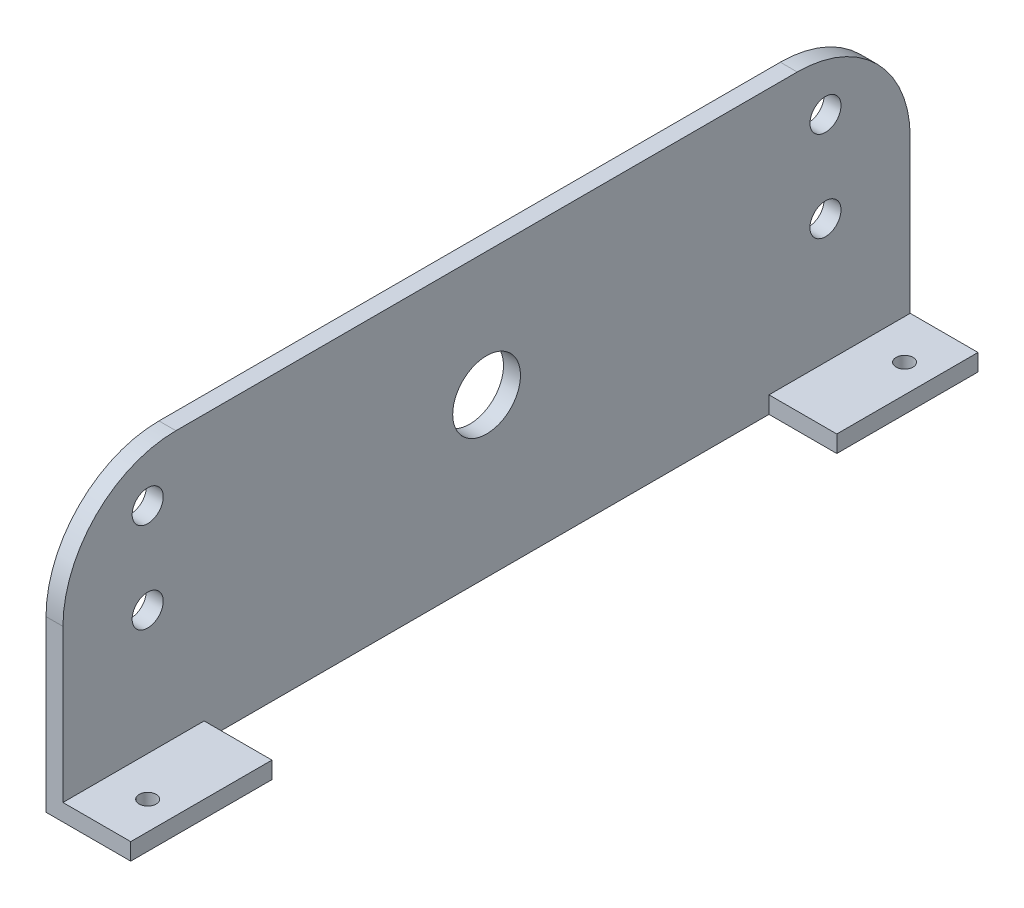
ISO-10303-21;
HEADER;
FILE_DESCRIPTION(('STEP AP214'),'2;1');
FILE_NAME('part.step','',(''),(''),'','','');
FILE_SCHEMA(('AUTOMOTIVE_DESIGN { 1 0 10303 214 1 1 1 1 }'));
ENDSEC;
DATA;
#1=APPLICATION_CONTEXT('core data for automotive mechanical design processes');
#2=APPLICATION_PROTOCOL_DEFINITION('international standard','automotive_design',2000,#1);
#3=PRODUCT_CONTEXT('',#1,'mechanical');
#4=PRODUCT('Part','Part','',(#3));
#5=PRODUCT_RELATED_PRODUCT_CATEGORY('part','',(#4));
#6=PRODUCT_DEFINITION_FORMATION('','',#4);
#7=PRODUCT_DEFINITION_CONTEXT('part definition',#1,'design');
#8=PRODUCT_DEFINITION('design','',#6,#7);
#9=PRODUCT_DEFINITION_SHAPE('','',#8);
#10=(LENGTH_UNIT() NAMED_UNIT(*) SI_UNIT(.MILLI.,.METRE.));
#11=(NAMED_UNIT(*) PLANE_ANGLE_UNIT() SI_UNIT($,.RADIAN.));
#12=(NAMED_UNIT(*) SI_UNIT($,.STERADIAN.) SOLID_ANGLE_UNIT());
#13=UNCERTAINTY_MEASURE_WITH_UNIT(LENGTH_MEASURE(1.E-05),#10,'distance_accuracy_value','');
#14=(GEOMETRIC_REPRESENTATION_CONTEXT(3) GLOBAL_UNCERTAINTY_ASSIGNED_CONTEXT((#13)) GLOBAL_UNIT_ASSIGNED_CONTEXT((#10,
#11,#12)) REPRESENTATION_CONTEXT('',''));
#15=CARTESIAN_POINT('',(0.,0.,0.));
#16=DIRECTION('',(0.,0.,1.));
#17=DIRECTION('',(1.,0.,0.));
#18=AXIS2_PLACEMENT_3D('',#15,#16,#17);
#19=CARTESIAN_POINT('',(3.,0.,0.));
#20=DIRECTION('',(-1.,0.,0.));
#21=DIRECTION('',(0.,0.,1.));
#22=AXIS2_PLACEMENT_3D('',#19,#20,#21);
#23=PLANE('',#22);
#24=CARTESIAN_POINT('',(3.,28.,0.));
#25=DIRECTION('',(-1.,0.,0.));
#26=DIRECTION('',(0.,0.,1.));
#27=AXIS2_PLACEMENT_3D('',#24,#25,#26);
#28=CIRCLE('',#27,5.99999999999999);
#29=CARTESIAN_POINT('',(3.,28.,5.99999999999999));
#30=VERTEX_POINT('',#29);
#31=EDGE_CURVE('E260',#30,#30,#28,.T.);
#32=ORIENTED_EDGE('',*,*,#31,.T.);
#33=EDGE_LOOP('',(#32));
#34=FACE_BOUND('',#33,.T.);
#35=CARTESIAN_POINT('',(3.,41.,-60.));
#36=DIRECTION('',(1.,0.,0.));
#37=DIRECTION('',(0.,0.,-1.));
#38=AXIS2_PLACEMENT_3D('',#35,#36,#37);
#39=CIRCLE('',#38,2.74999999999999);
#40=CARTESIAN_POINT('',(3.,41.,-62.75));
#41=VERTEX_POINT('',#40);
#42=EDGE_CURVE('E257',#41,#41,#39,.T.);
#43=ORIENTED_EDGE('',*,*,#42,.F.);
#44=EDGE_LOOP('',(#43));
#45=FACE_BOUND('',#44,.T.);
#46=CARTESIAN_POINT('',(3.,41.,60.));
#47=DIRECTION('',(1.,0.,0.));
#48=DIRECTION('',(0.,0.,-1.));
#49=AXIS2_PLACEMENT_3D('',#46,#47,#48);
#50=CIRCLE('',#49,2.74999999999999);
#51=CARTESIAN_POINT('',(3.,41.,57.25));
#52=VERTEX_POINT('',#51);
#53=EDGE_CURVE('E251',#52,#52,#50,.T.);
#54=ORIENTED_EDGE('',*,*,#53,.F.);
#55=EDGE_LOOP('',(#54));
#56=FACE_BOUND('',#55,.T.);
#57=CARTESIAN_POINT('',(3.,25.,60.));
#58=DIRECTION('',(1.,0.,0.));
#59=DIRECTION('',(0.,0.,-1.));
#60=AXIS2_PLACEMENT_3D('',#57,#58,#59);
#61=CIRCLE('',#60,2.74999999999999);
#62=CARTESIAN_POINT('',(3.,25.,57.25));
#63=VERTEX_POINT('',#62);
#64=EDGE_CURVE('E245',#63,#63,#61,.T.);
#65=ORIENTED_EDGE('',*,*,#64,.F.);
#66=EDGE_LOOP('',(#65));
#67=FACE_BOUND('',#66,.T.);
#68=CARTESIAN_POINT('',(3.,25.,-60.));
#69=DIRECTION('',(1.,0.,0.));
#70=DIRECTION('',(0.,0.,-1.));
#71=AXIS2_PLACEMENT_3D('',#68,#69,#70);
#72=CIRCLE('',#71,2.74999999999999);
#73=CARTESIAN_POINT('',(3.,25.,-62.75));
#74=VERTEX_POINT('',#73);
#75=EDGE_CURVE('E239',#74,#74,#72,.T.);
#76=ORIENTED_EDGE('',*,*,#75,.F.);
#77=EDGE_LOOP('',(#76));
#78=FACE_BOUND('',#77,.T.);
#79=DIRECTION('',(0.,0.,-1.));
#80=VECTOR('',#79,1.);
#81=CARTESIAN_POINT('',(3.,50.,75.));
#82=LINE('',#81,#80);
#83=CARTESIAN_POINT('',(3.,50.,55.));
#84=VERTEX_POINT('',#83);
#85=CARTESIAN_POINT('',(3.,50.,-55.));
#86=VERTEX_POINT('',#85);
#87=EDGE_CURVE('E211',#84,#86,#82,.T.);
#88=ORIENTED_EDGE('',*,*,#87,.F.);
#89=CARTESIAN_POINT('',(3.,30.,55.));
#90=DIRECTION('',(-1.,0.,0.));
#91=DIRECTION('',(0.,0.,1.));
#92=AXIS2_PLACEMENT_3D('',#89,#90,#91);
#93=CIRCLE('',#92,20.);
#94=CARTESIAN_POINT('',(3.,30.,75.));
#95=VERTEX_POINT('',#94);
#96=EDGE_CURVE('E41',#84,#95,#93,.F.);
#97=ORIENTED_EDGE('',*,*,#96,.T.);
#98=DIRECTION('',(0.,1.,0.));
#99=VECTOR('',#98,1.);
#100=CARTESIAN_POINT('',(3.,0.,75.));
#101=LINE('',#100,#99);
#102=CARTESIAN_POINT('',(3.,2.99999999999998,75.));
#103=VERTEX_POINT('',#102);
#104=EDGE_CURVE('E205',#103,#95,#101,.T.);
#105=ORIENTED_EDGE('',*,*,#104,.F.);
#106=DIRECTION('',(0.,0.,1.));
#107=VECTOR('',#106,1.);
#108=CARTESIAN_POINT('',(3.,2.99999999999998,75.));
#109=LINE('',#108,#107);
#110=CARTESIAN_POINT('',(3.,2.99999999999998,50.));
#111=VERTEX_POINT('',#110);
#112=EDGE_CURVE('E151',#111,#103,#109,.T.);
#113=ORIENTED_EDGE('',*,*,#112,.F.);
#114=DIRECTION('',(0.,1.,0.));
#115=VECTOR('',#114,1.);
#116=CARTESIAN_POINT('',(3.,2.99999999999998,50.));
#117=LINE('',#116,#115);
#118=CARTESIAN_POINT('',(3.,0.,50.));
#119=VERTEX_POINT('',#118);
#120=EDGE_CURVE('E148',#119,#111,#117,.T.);
#121=ORIENTED_EDGE('',*,*,#120,.F.);
#122=DIRECTION('',(0.,0.,1.));
#123=VECTOR('',#122,1.);
#124=CARTESIAN_POINT('',(3.,0.,-75.));
#125=LINE('',#124,#123);
#126=CARTESIAN_POINT('',(3.,0.,-50.));
#127=VERTEX_POINT('',#126);
#128=EDGE_CURVE('E182',#127,#119,#125,.T.);
#129=ORIENTED_EDGE('',*,*,#128,.F.);
#130=DIRECTION('',(0.,-1.,0.));
#131=VECTOR('',#130,1.);
#132=CARTESIAN_POINT('',(3.,0.,-50.));
#133=LINE('',#132,#131);
#134=CARTESIAN_POINT('',(3.,2.99999999999999,-50.));
#135=VERTEX_POINT('',#134);
#136=EDGE_CURVE('E142',#135,#127,#133,.T.);
#137=ORIENTED_EDGE('',*,*,#136,.F.);
#138=DIRECTION('',(0.,0.,1.));
#139=VECTOR('',#138,1.);
#140=CARTESIAN_POINT('',(3.,2.99999999999999,-50.));
#141=LINE('',#140,#139);
#142=CARTESIAN_POINT('',(3.,3.,-75.));
#143=VERTEX_POINT('',#142);
#144=EDGE_CURVE('E146',#143,#135,#141,.T.);
#145=ORIENTED_EDGE('',*,*,#144,.F.);
#146=DIRECTION('',(0.,-1.,0.));
#147=VECTOR('',#146,1.);
#148=CARTESIAN_POINT('',(3.,50.,-75.));
#149=LINE('',#148,#147);
#150=CARTESIAN_POINT('',(3.,30.,-75.));
#151=VERTEX_POINT('',#150);
#152=EDGE_CURVE('E186',#151,#143,#149,.T.);
#153=ORIENTED_EDGE('',*,*,#152,.F.);
#154=CARTESIAN_POINT('',(3.,30.,-55.));
#155=DIRECTION('',(-1.,0.,0.));
#156=DIRECTION('',(0.,0.,1.));
#157=AXIS2_PLACEMENT_3D('',#154,#155,#156);
#158=CIRCLE('',#157,20.);
#159=EDGE_CURVE('E53',#151,#86,#158,.F.);
#160=ORIENTED_EDGE('',*,*,#159,.T.);
#161=EDGE_LOOP('',(#88,#97,#105,#113,#121,#129,#137,#145,#153,#160));
#162=FACE_BOUND('',#161,.T.);
#163=ADVANCED_FACE('F33',(#34,#45,#56,#67,#78,#162),#23,.F.);
#164=CARTESIAN_POINT('',(3.,0.,75.));
#165=DIRECTION('',(0.,0.,1.));
#166=DIRECTION('',(0.,-1.,0.));
#167=AXIS2_PLACEMENT_3D('',#164,#165,#166);
#168=PLANE('',#167);
#169=ORIENTED_EDGE('',*,*,#104,.T.);
#170=DIRECTION('',(-1.,0.,0.));
#171=VECTOR('',#170,1.);
#172=CARTESIAN_POINT('',(3.,30.,75.));
#173=LINE('',#172,#171);
#174=CARTESIAN_POINT('',(0.,30.,75.));
#175=VERTEX_POINT('',#174);
#176=EDGE_CURVE('E187',#95,#175,#173,.T.);
#177=ORIENTED_EDGE('',*,*,#176,.T.);
#178=DIRECTION('',(0.,1.,0.));
#179=VECTOR('',#178,1.);
#180=CARTESIAN_POINT('',(0.,0.,75.));
#181=LINE('',#180,#179);
#182=CARTESIAN_POINT('',(0.,0.,75.));
#183=VERTEX_POINT('',#182);
#184=EDGE_CURVE('E193',#183,#175,#181,.T.);
#185=ORIENTED_EDGE('',*,*,#184,.F.);
#186=DIRECTION('',(-1.,0.,0.));
#187=VECTOR('',#186,1.);
#188=CARTESIAN_POINT('',(3.,0.,75.));
#189=LINE('',#188,#187);
#190=CARTESIAN_POINT('',(15.,0.,75.));
#191=VERTEX_POINT('',#190);
#192=EDGE_CURVE('E206',#191,#183,#189,.T.);
#193=ORIENTED_EDGE('',*,*,#192,.F.);
#194=DIRECTION('',(0.,-1.,0.));
#195=VECTOR('',#194,1.);
#196=CARTESIAN_POINT('',(15.,0.,75.));
#197=LINE('',#196,#195);
#198=CARTESIAN_POINT('',(15.,2.99999999999998,75.));
#199=VERTEX_POINT('',#198);
#200=EDGE_CURVE('E164',#199,#191,#197,.T.);
#201=ORIENTED_EDGE('',*,*,#200,.F.);
#202=DIRECTION('',(-1.,0.,0.));
#203=VECTOR('',#202,1.);
#204=CARTESIAN_POINT('',(15.,2.99999999999998,75.));
#205=LINE('',#204,#203);
#206=EDGE_CURVE('E167',#199,#103,#205,.T.);
#207=ORIENTED_EDGE('',*,*,#206,.T.);
#208=EDGE_LOOP('',(#169,#177,#185,#193,#201,#207));
#209=FACE_BOUND('',#208,.T.);
#210=ADVANCED_FACE('F290',(#209),#168,.T.);
#211=CARTESIAN_POINT('',(3.,0.,-75.));
#212=DIRECTION('',(0.,-1.,0.));
#213=DIRECTION('',(0.,0.,-1.));
#214=AXIS2_PLACEMENT_3D('',#211,#212,#213);
#215=PLANE('',#214);
#216=CARTESIAN_POINT('',(10.,0.,67.));
#217=DIRECTION('',(0.,-1.,0.));
#218=DIRECTION('',(0.,0.,-1.));
#219=AXIS2_PLACEMENT_3D('',#216,#217,#218);
#220=CIRCLE('',#219,1.49999999999999);
#221=CARTESIAN_POINT('',(10.,0.,65.5));
#222=VERTEX_POINT('',#221);
#223=EDGE_CURVE('E233',#222,#222,#220,.T.);
#224=ORIENTED_EDGE('',*,*,#223,.F.);
#225=EDGE_LOOP('',(#224));
#226=FACE_BOUND('',#225,.T.);
#227=CARTESIAN_POINT('',(10.,0.,-67.));
#228=DIRECTION('',(0.,-1.,0.));
#229=DIRECTION('',(0.,0.,-1.));
#230=AXIS2_PLACEMENT_3D('',#227,#228,#229);
#231=CIRCLE('',#230,1.49999999999999);
#232=CARTESIAN_POINT('',(10.,0.,-68.5));
#233=VERTEX_POINT('',#232);
#234=EDGE_CURVE('E223',#233,#233,#231,.T.);
#235=ORIENTED_EDGE('',*,*,#234,.F.);
#236=EDGE_LOOP('',(#235));
#237=FACE_BOUND('',#236,.T.);
#238=DIRECTION('',(0.,0.,1.));
#239=VECTOR('',#238,1.);
#240=CARTESIAN_POINT('',(0.,0.,-75.));
#241=LINE('',#240,#239);
#242=CARTESIAN_POINT('',(0.,0.,-75.));
#243=VERTEX_POINT('',#242);
#244=EDGE_CURVE('E202',#243,#183,#241,.T.);
#245=ORIENTED_EDGE('',*,*,#244,.F.);
#246=DIRECTION('',(-1.,0.,0.));
#247=VECTOR('',#246,1.);
#248=CARTESIAN_POINT('',(3.,0.,-75.));
#249=LINE('',#248,#247);
#250=CARTESIAN_POINT('',(15.,0.,-75.));
#251=VERTEX_POINT('',#250);
#252=EDGE_CURVE('E185',#251,#243,#249,.T.);
#253=ORIENTED_EDGE('',*,*,#252,.F.);
#254=DIRECTION('',(0.,0.,-1.));
#255=VECTOR('',#254,1.);
#256=CARTESIAN_POINT('',(15.,0.,-75.));
#257=LINE('',#256,#255);
#258=CARTESIAN_POINT('',(15.,0.,-50.));
#259=VERTEX_POINT('',#258);
#260=EDGE_CURVE('E132',#259,#251,#257,.T.);
#261=ORIENTED_EDGE('',*,*,#260,.F.);
#262=DIRECTION('',(-1.,0.,0.));
#263=VECTOR('',#262,1.);
#264=CARTESIAN_POINT('',(15.,0.,-50.));
#265=LINE('',#264,#263);
#266=EDGE_CURVE('E128',#259,#127,#265,.T.);
#267=ORIENTED_EDGE('',*,*,#266,.T.);
#268=ORIENTED_EDGE('',*,*,#128,.T.);
#269=DIRECTION('',(-1.,0.,0.));
#270=VECTOR('',#269,1.);
#271=CARTESIAN_POINT('',(15.,0.,50.));
#272=LINE('',#271,#270);
#273=CARTESIAN_POINT('',(15.,0.,50.));
#274=VERTEX_POINT('',#273);
#275=EDGE_CURVE('E197',#274,#119,#272,.T.);
#276=ORIENTED_EDGE('',*,*,#275,.F.);
#277=DIRECTION('',(0.,0.,-1.));
#278=VECTOR('',#277,1.);
#279=CARTESIAN_POINT('',(15.,0.,50.));
#280=LINE('',#279,#278);
#281=EDGE_CURVE('E157',#191,#274,#280,.T.);
#282=ORIENTED_EDGE('',*,*,#281,.F.);
#283=ORIENTED_EDGE('',*,*,#192,.T.);
#284=EDGE_LOOP('',(#245,#253,#261,#267,#268,#276,#282,#283));
#285=FACE_BOUND('',#284,.T.);
#286=ADVANCED_FACE('F315',(#226,#237,#285),#215,.T.);
#287=CARTESIAN_POINT('',(3.,50.,-75.));
#288=DIRECTION('',(0.,0.,-1.));
#289=DIRECTION('',(-1.,0.,0.));
#290=AXIS2_PLACEMENT_3D('',#287,#288,#289);
#291=PLANE('',#290);
#292=DIRECTION('',(0.,-1.,0.));
#293=VECTOR('',#292,1.);
#294=CARTESIAN_POINT('',(0.,50.,-75.));
#295=LINE('',#294,#293);
#296=CARTESIAN_POINT('',(0.,30.,-75.));
#297=VERTEX_POINT('',#296);
#298=EDGE_CURVE('E200',#297,#243,#295,.T.);
#299=ORIENTED_EDGE('',*,*,#298,.F.);
#300=DIRECTION('',(-1.,0.,0.));
#301=VECTOR('',#300,1.);
#302=CARTESIAN_POINT('',(3.,30.,-75.));
#303=LINE('',#302,#301);
#304=EDGE_CURVE('E11',#297,#151,#303,.F.);
#305=ORIENTED_EDGE('',*,*,#304,.T.);
#306=ORIENTED_EDGE('',*,*,#152,.T.);
#307=DIRECTION('',(-1.,0.,0.));
#308=VECTOR('',#307,1.);
#309=CARTESIAN_POINT('',(15.,3.,-75.));
#310=LINE('',#309,#308);
#311=CARTESIAN_POINT('',(15.,3.,-75.));
#312=VERTEX_POINT('',#311);
#313=EDGE_CURVE('E153',#312,#143,#310,.T.);
#314=ORIENTED_EDGE('',*,*,#313,.F.);
#315=DIRECTION('',(0.,1.,0.));
#316=VECTOR('',#315,1.);
#317=CARTESIAN_POINT('',(15.,3.,-75.));
#318=LINE('',#317,#316);
#319=EDGE_CURVE('E138',#251,#312,#318,.T.);
#320=ORIENTED_EDGE('',*,*,#319,.F.);
#321=ORIENTED_EDGE('',*,*,#252,.T.);
#322=EDGE_LOOP('',(#299,#305,#306,#314,#320,#321));
#323=FACE_BOUND('',#322,.T.);
#324=ADVANCED_FACE('F217',(#323),#291,.T.);
#325=CARTESIAN_POINT('',(3.,50.,75.));
#326=DIRECTION('',(0.,1.,0.));
#327=DIRECTION('',(0.,0.,1.));
#328=AXIS2_PLACEMENT_3D('',#325,#326,#327);
#329=PLANE('',#328);
#330=DIRECTION('',(0.,0.,-1.));
#331=VECTOR('',#330,1.);
#332=CARTESIAN_POINT('',(0.,50.,75.));
#333=LINE('',#332,#331);
#334=CARTESIAN_POINT('',(0.,50.,55.));
#335=VERTEX_POINT('',#334);
#336=CARTESIAN_POINT('',(0.,50.,-55.));
#337=VERTEX_POINT('',#336);
#338=EDGE_CURVE('E196',#335,#337,#333,.T.);
#339=ORIENTED_EDGE('',*,*,#338,.F.);
#340=DIRECTION('',(-1.,0.,0.));
#341=VECTOR('',#340,1.);
#342=CARTESIAN_POINT('',(3.,50.,55.));
#343=LINE('',#342,#341);
#344=EDGE_CURVE('E300',#335,#84,#343,.F.);
#345=ORIENTED_EDGE('',*,*,#344,.T.);
#346=ORIENTED_EDGE('',*,*,#87,.T.);
#347=DIRECTION('',(-1.,0.,0.));
#348=VECTOR('',#347,1.);
#349=CARTESIAN_POINT('',(3.,50.,-55.));
#350=LINE('',#349,#348);
#351=EDGE_CURVE('E296',#86,#337,#350,.T.);
#352=ORIENTED_EDGE('',*,*,#351,.T.);
#353=EDGE_LOOP('',(#339,#345,#346,#352));
#354=FACE_BOUND('',#353,.T.);
#355=ADVANCED_FACE('F274',(#354),#329,.T.);
#356=CARTESIAN_POINT('',(0.,0.,0.));
#357=DIRECTION('',(-1.,0.,0.));
#358=DIRECTION('',(0.,0.,1.));
#359=AXIS2_PLACEMENT_3D('',#356,#357,#358);
#360=PLANE('',#359);
#361=CARTESIAN_POINT('',(0.,28.,0.));
#362=DIRECTION('',(-1.,0.,0.));
#363=DIRECTION('',(0.,0.,1.));
#364=AXIS2_PLACEMENT_3D('',#361,#362,#363);
#365=CIRCLE('',#364,5.99999999999999);
#366=CARTESIAN_POINT('',(0.,28.,5.99999999999999));
#367=VERTEX_POINT('',#366);
#368=EDGE_CURVE('E263',#367,#367,#365,.T.);
#369=ORIENTED_EDGE('',*,*,#368,.F.);
#370=EDGE_LOOP('',(#369));
#371=FACE_BOUND('',#370,.T.);
#372=CARTESIAN_POINT('',(0.,41.,-60.));
#373=DIRECTION('',(1.,0.,0.));
#374=DIRECTION('',(0.,0.,-1.));
#375=AXIS2_PLACEMENT_3D('',#372,#373,#374);
#376=CIRCLE('',#375,2.74999999999999);
#377=CARTESIAN_POINT('',(0.,41.,-62.75));
#378=VERTEX_POINT('',#377);
#379=EDGE_CURVE('E254',#378,#378,#376,.T.);
#380=ORIENTED_EDGE('',*,*,#379,.T.);
#381=EDGE_LOOP('',(#380));
#382=FACE_BOUND('',#381,.T.);
#383=CARTESIAN_POINT('',(0.,41.,60.));
#384=DIRECTION('',(1.,0.,0.));
#385=DIRECTION('',(0.,0.,-1.));
#386=AXIS2_PLACEMENT_3D('',#383,#384,#385);
#387=CIRCLE('',#386,2.74999999999999);
#388=CARTESIAN_POINT('',(0.,41.,57.25));
#389=VERTEX_POINT('',#388);
#390=EDGE_CURVE('E248',#389,#389,#387,.T.);
#391=ORIENTED_EDGE('',*,*,#390,.T.);
#392=EDGE_LOOP('',(#391));
#393=FACE_BOUND('',#392,.T.);
#394=CARTESIAN_POINT('',(0.,25.,60.));
#395=DIRECTION('',(1.,0.,0.));
#396=DIRECTION('',(0.,0.,-1.));
#397=AXIS2_PLACEMENT_3D('',#394,#395,#396);
#398=CIRCLE('',#397,2.74999999999999);
#399=CARTESIAN_POINT('',(0.,25.,57.25));
#400=VERTEX_POINT('',#399);
#401=EDGE_CURVE('E242',#400,#400,#398,.T.);
#402=ORIENTED_EDGE('',*,*,#401,.T.);
#403=EDGE_LOOP('',(#402));
#404=FACE_BOUND('',#403,.T.);
#405=CARTESIAN_POINT('',(0.,25.,-60.));
#406=DIRECTION('',(1.,0.,0.));
#407=DIRECTION('',(0.,0.,-1.));
#408=AXIS2_PLACEMENT_3D('',#405,#406,#407);
#409=CIRCLE('',#408,2.74999999999999);
#410=CARTESIAN_POINT('',(0.,25.,-62.75));
#411=VERTEX_POINT('',#410);
#412=EDGE_CURVE('E236',#411,#411,#409,.T.);
#413=ORIENTED_EDGE('',*,*,#412,.T.);
#414=EDGE_LOOP('',(#413));
#415=FACE_BOUND('',#414,.T.);
#416=ORIENTED_EDGE('',*,*,#184,.T.);
#417=CARTESIAN_POINT('',(0.,30.,55.));
#418=DIRECTION('',(-1.,0.,0.));
#419=DIRECTION('',(0.,0.,1.));
#420=AXIS2_PLACEMENT_3D('',#417,#418,#419);
#421=CIRCLE('',#420,20.);
#422=EDGE_CURVE('E285',#175,#335,#421,.T.);
#423=ORIENTED_EDGE('',*,*,#422,.T.);
#424=ORIENTED_EDGE('',*,*,#338,.T.);
#425=CARTESIAN_POINT('',(0.,30.,-55.));
#426=DIRECTION('',(-1.,0.,0.));
#427=DIRECTION('',(0.,0.,1.));
#428=AXIS2_PLACEMENT_3D('',#425,#426,#427);
#429=CIRCLE('',#428,20.);
#430=EDGE_CURVE('E295',#337,#297,#429,.T.);
#431=ORIENTED_EDGE('',*,*,#430,.T.);
#432=ORIENTED_EDGE('',*,*,#298,.T.);
#433=ORIENTED_EDGE('',*,*,#244,.T.);
#434=EDGE_LOOP('',(#416,#423,#424,#431,#432,#433));
#435=FACE_BOUND('',#434,.T.);
#436=ADVANCED_FACE('F270',(#371,#382,#393,#404,#415,#435),#360,.T.);
#437=CARTESIAN_POINT('',(15.,2.99999999999998,50.));
#438=DIRECTION('',(0.,0.,1.));
#439=DIRECTION('',(1.,0.,0.));
#440=AXIS2_PLACEMENT_3D('',#437,#438,#439);
#441=PLANE('',#440);
#442=ORIENTED_EDGE('',*,*,#120,.T.);
#443=DIRECTION('',(-1.,0.,0.));
#444=VECTOR('',#443,1.);
#445=CARTESIAN_POINT('',(15.,2.99999999999998,50.));
#446=LINE('',#445,#444);
#447=CARTESIAN_POINT('',(15.,2.99999999999998,50.));
#448=VERTEX_POINT('',#447);
#449=EDGE_CURVE('E170',#448,#111,#446,.T.);
#450=ORIENTED_EDGE('',*,*,#449,.F.);
#451=DIRECTION('',(0.,1.,0.));
#452=VECTOR('',#451,1.);
#453=CARTESIAN_POINT('',(15.,2.99999999999998,50.));
#454=LINE('',#453,#452);
#455=EDGE_CURVE('E160',#274,#448,#454,.T.);
#456=ORIENTED_EDGE('',*,*,#455,.F.);
#457=ORIENTED_EDGE('',*,*,#275,.T.);
#458=EDGE_LOOP('',(#442,#450,#456,#457));
#459=FACE_BOUND('',#458,.T.);
#460=ADVANCED_FACE('F273',(#459),#441,.F.);
#461=CARTESIAN_POINT('',(15.,2.99999999999998,75.));
#462=DIRECTION('',(0.,-1.,0.));
#463=DIRECTION('',(0.,0.,-1.));
#464=AXIS2_PLACEMENT_3D('',#461,#462,#463);
#465=PLANE('',#464);
#466=CARTESIAN_POINT('',(10.,2.99999999999998,67.));
#467=DIRECTION('',(0.,-1.,0.));
#468=DIRECTION('',(0.,0.,-1.));
#469=AXIS2_PLACEMENT_3D('',#466,#467,#468);
#470=CIRCLE('',#469,1.49999999999999);
#471=CARTESIAN_POINT('',(10.,2.99999999999998,65.5));
#472=VERTEX_POINT('',#471);
#473=EDGE_CURVE('E230',#472,#472,#470,.T.);
#474=ORIENTED_EDGE('',*,*,#473,.T.);
#475=EDGE_LOOP('',(#474));
#476=FACE_BOUND('',#475,.T.);
#477=ORIENTED_EDGE('',*,*,#112,.T.);
#478=ORIENTED_EDGE('',*,*,#206,.F.);
#479=DIRECTION('',(0.,0.,1.));
#480=VECTOR('',#479,1.);
#481=CARTESIAN_POINT('',(15.,2.99999999999998,75.));
#482=LINE('',#481,#480);
#483=EDGE_CURVE('E162',#448,#199,#482,.T.);
#484=ORIENTED_EDGE('',*,*,#483,.F.);
#485=ORIENTED_EDGE('',*,*,#449,.T.);
#486=EDGE_LOOP('',(#477,#478,#484,#485));
#487=FACE_BOUND('',#486,.T.);
#488=ADVANCED_FACE('F342',(#476,#487),#465,.F.);
#489=CARTESIAN_POINT('',(15.,0.,0.));
#490=DIRECTION('',(-1.,0.,0.));
#491=DIRECTION('',(0.,0.,1.));
#492=AXIS2_PLACEMENT_3D('',#489,#490,#491);
#493=PLANE('',#492);
#494=ORIENTED_EDGE('',*,*,#281,.T.);
#495=ORIENTED_EDGE('',*,*,#455,.T.);
#496=ORIENTED_EDGE('',*,*,#483,.T.);
#497=ORIENTED_EDGE('',*,*,#200,.T.);
#498=EDGE_LOOP('',(#494,#495,#496,#497));
#499=FACE_BOUND('',#498,.T.);
#500=ADVANCED_FACE('F350',(#499),#493,.F.);
#501=CARTESIAN_POINT('',(15.,2.99999999999999,-50.));
#502=DIRECTION('',(0.,-1.,0.));
#503=DIRECTION('',(0.,0.,-1.));
#504=AXIS2_PLACEMENT_3D('',#501,#502,#503);
#505=PLANE('',#504);
#506=CARTESIAN_POINT('',(10.,3.,-67.));
#507=DIRECTION('',(0.,-1.,0.));
#508=DIRECTION('',(0.,0.,-1.));
#509=AXIS2_PLACEMENT_3D('',#506,#507,#508);
#510=CIRCLE('',#509,1.49999999999999);
#511=CARTESIAN_POINT('',(10.,3.,-68.5));
#512=VERTEX_POINT('',#511);
#513=EDGE_CURVE('E219',#512,#512,#510,.T.);
#514=ORIENTED_EDGE('',*,*,#513,.T.);
#515=EDGE_LOOP('',(#514));
#516=FACE_BOUND('',#515,.T.);
#517=ORIENTED_EDGE('',*,*,#144,.T.);
#518=DIRECTION('',(-1.,0.,0.));
#519=VECTOR('',#518,1.);
#520=CARTESIAN_POINT('',(15.,2.99999999999999,-50.));
#521=LINE('',#520,#519);
#522=CARTESIAN_POINT('',(15.,2.99999999999999,-50.));
#523=VERTEX_POINT('',#522);
#524=EDGE_CURVE('E125',#523,#135,#521,.T.);
#525=ORIENTED_EDGE('',*,*,#524,.F.);
#526=DIRECTION('',(0.,0.,1.));
#527=VECTOR('',#526,1.);
#528=CARTESIAN_POINT('',(15.,2.99999999999999,-50.));
#529=LINE('',#528,#527);
#530=EDGE_CURVE('E133',#312,#523,#529,.T.);
#531=ORIENTED_EDGE('',*,*,#530,.F.);
#532=ORIENTED_EDGE('',*,*,#313,.T.);
#533=EDGE_LOOP('',(#517,#525,#531,#532));
#534=FACE_BOUND('',#533,.T.);
#535=ADVANCED_FACE('F144',(#516,#534),#505,.F.);
#536=CARTESIAN_POINT('',(15.,0.,-50.));
#537=DIRECTION('',(0.,0.,-1.));
#538=DIRECTION('',(-1.,0.,0.));
#539=AXIS2_PLACEMENT_3D('',#536,#537,#538);
#540=PLANE('',#539);
#541=ORIENTED_EDGE('',*,*,#136,.T.);
#542=ORIENTED_EDGE('',*,*,#266,.F.);
#543=DIRECTION('',(0.,-1.,0.));
#544=VECTOR('',#543,1.);
#545=CARTESIAN_POINT('',(15.,0.,-50.));
#546=LINE('',#545,#544);
#547=EDGE_CURVE('E121',#523,#259,#546,.T.);
#548=ORIENTED_EDGE('',*,*,#547,.F.);
#549=ORIENTED_EDGE('',*,*,#524,.T.);
#550=EDGE_LOOP('',(#541,#542,#548,#549));
#551=FACE_BOUND('',#550,.T.);
#552=ADVANCED_FACE('F123',(#551),#540,.F.);
#553=CARTESIAN_POINT('',(15.,0.,0.));
#554=DIRECTION('',(-1.,0.,0.));
#555=DIRECTION('',(0.,0.,1.));
#556=AXIS2_PLACEMENT_3D('',#553,#554,#555);
#557=PLANE('',#556);
#558=ORIENTED_EDGE('',*,*,#530,.T.);
#559=ORIENTED_EDGE('',*,*,#547,.T.);
#560=ORIENTED_EDGE('',*,*,#260,.T.);
#561=ORIENTED_EDGE('',*,*,#319,.T.);
#562=EDGE_LOOP('',(#558,#559,#560,#561));
#563=FACE_BOUND('',#562,.T.);
#564=ADVANCED_FACE('F136',(#563),#557,.F.);
#565=CARTESIAN_POINT('',(10.,0.,-67.));
#566=DIRECTION('',(0.,-1.,0.));
#567=DIRECTION('',(0.,0.,-1.));
#568=AXIS2_PLACEMENT_3D('',#565,#566,#567);
#569=CYLINDRICAL_SURFACE('',#568,1.49999999999999);
#570=ORIENTED_EDGE('',*,*,#234,.T.);
#571=EDGE_LOOP('',(#570));
#572=FACE_BOUND('',#571,.T.);
#573=ORIENTED_EDGE('',*,*,#513,.F.);
#574=EDGE_LOOP('',(#573));
#575=FACE_BOUND('',#574,.T.);
#576=ADVANCED_FACE('F378',(#572,#575),#569,.F.);
#577=CARTESIAN_POINT('',(10.,0.,67.));
#578=DIRECTION('',(0.,-1.,0.));
#579=DIRECTION('',(0.,0.,-1.));
#580=AXIS2_PLACEMENT_3D('',#577,#578,#579);
#581=CYLINDRICAL_SURFACE('',#580,1.49999999999999);
#582=ORIENTED_EDGE('',*,*,#223,.T.);
#583=EDGE_LOOP('',(#582));
#584=FACE_BOUND('',#583,.T.);
#585=ORIENTED_EDGE('',*,*,#473,.F.);
#586=EDGE_LOOP('',(#585));
#587=FACE_BOUND('',#586,.T.);
#588=ADVANCED_FACE('F384',(#584,#587),#581,.F.);
#589=CARTESIAN_POINT('',(3.,25.,-60.));
#590=DIRECTION('',(1.,0.,0.));
#591=DIRECTION('',(0.,0.,-1.));
#592=AXIS2_PLACEMENT_3D('',#589,#590,#591);
#593=CYLINDRICAL_SURFACE('',#592,2.74999999999999);
#594=ORIENTED_EDGE('',*,*,#412,.F.);
#595=EDGE_LOOP('',(#594));
#596=FACE_BOUND('',#595,.T.);
#597=ORIENTED_EDGE('',*,*,#75,.T.);
#598=EDGE_LOOP('',(#597));
#599=FACE_BOUND('',#598,.T.);
#600=ADVANCED_FACE('F392',(#596,#599),#593,.F.);
#601=CARTESIAN_POINT('',(3.,25.,60.));
#602=DIRECTION('',(1.,0.,0.));
#603=DIRECTION('',(0.,0.,-1.));
#604=AXIS2_PLACEMENT_3D('',#601,#602,#603);
#605=CYLINDRICAL_SURFACE('',#604,2.74999999999999);
#606=ORIENTED_EDGE('',*,*,#401,.F.);
#607=EDGE_LOOP('',(#606));
#608=FACE_BOUND('',#607,.T.);
#609=ORIENTED_EDGE('',*,*,#64,.T.);
#610=EDGE_LOOP('',(#609));
#611=FACE_BOUND('',#610,.T.);
#612=ADVANCED_FACE('F400',(#608,#611),#605,.F.);
#613=CARTESIAN_POINT('',(3.,41.,60.));
#614=DIRECTION('',(1.,0.,0.));
#615=DIRECTION('',(0.,0.,-1.));
#616=AXIS2_PLACEMENT_3D('',#613,#614,#615);
#617=CYLINDRICAL_SURFACE('',#616,2.74999999999999);
#618=ORIENTED_EDGE('',*,*,#390,.F.);
#619=EDGE_LOOP('',(#618));
#620=FACE_BOUND('',#619,.T.);
#621=ORIENTED_EDGE('',*,*,#53,.T.);
#622=EDGE_LOOP('',(#621));
#623=FACE_BOUND('',#622,.T.);
#624=ADVANCED_FACE('F408',(#620,#623),#617,.F.);
#625=CARTESIAN_POINT('',(3.,41.,-60.));
#626=DIRECTION('',(1.,0.,0.));
#627=DIRECTION('',(0.,0.,-1.));
#628=AXIS2_PLACEMENT_3D('',#625,#626,#627);
#629=CYLINDRICAL_SURFACE('',#628,2.74999999999999);
#630=ORIENTED_EDGE('',*,*,#379,.F.);
#631=EDGE_LOOP('',(#630));
#632=FACE_BOUND('',#631,.T.);
#633=ORIENTED_EDGE('',*,*,#42,.T.);
#634=EDGE_LOOP('',(#633));
#635=FACE_BOUND('',#634,.T.);
#636=ADVANCED_FACE('F416',(#632,#635),#629,.F.);
#637=CARTESIAN_POINT('',(0.,28.,0.));
#638=DIRECTION('',(-1.,0.,0.));
#639=DIRECTION('',(0.,0.,1.));
#640=AXIS2_PLACEMENT_3D('',#637,#638,#639);
#641=CYLINDRICAL_SURFACE('',#640,5.99999999999999);
#642=ORIENTED_EDGE('',*,*,#368,.T.);
#643=EDGE_LOOP('',(#642));
#644=FACE_BOUND('',#643,.T.);
#645=ORIENTED_EDGE('',*,*,#31,.F.);
#646=EDGE_LOOP('',(#645));
#647=FACE_BOUND('',#646,.T.);
#648=ADVANCED_FACE('F267',(#644,#647),#641,.F.);
#649=CARTESIAN_POINT('',(3.,30.,55.));
#650=DIRECTION('',(-1.,0.,0.));
#651=DIRECTION('',(0.,0.,1.));
#652=AXIS2_PLACEMENT_3D('',#649,#650,#651);
#653=CYLINDRICAL_SURFACE('',#652,20.);
#654=ORIENTED_EDGE('',*,*,#96,.F.);
#655=ORIENTED_EDGE('',*,*,#344,.F.);
#656=ORIENTED_EDGE('',*,*,#422,.F.);
#657=ORIENTED_EDGE('',*,*,#176,.F.);
#658=EDGE_LOOP('',(#654,#655,#656,#657));
#659=FACE_BOUND('',#658,.T.);
#660=ADVANCED_FACE('F303',(#659),#653,.T.);
#661=CARTESIAN_POINT('',(3.,30.,-55.));
#662=DIRECTION('',(-1.,0.,0.));
#663=DIRECTION('',(0.,0.,1.));
#664=AXIS2_PLACEMENT_3D('',#661,#662,#663);
#665=CYLINDRICAL_SURFACE('',#664,20.);
#666=ORIENTED_EDGE('',*,*,#159,.F.);
#667=ORIENTED_EDGE('',*,*,#304,.F.);
#668=ORIENTED_EDGE('',*,*,#430,.F.);
#669=ORIENTED_EDGE('',*,*,#351,.F.);
#670=EDGE_LOOP('',(#666,#667,#668,#669));
#671=FACE_BOUND('',#670,.T.);
#672=ADVANCED_FACE('F35',(#671),#665,.T.);
#673=CLOSED_SHELL('',(#163,#210,#286,#324,#355,#436,#460,#488,#500,#535,#552,#564,#576,#588,
#600,#612,#624,#636,#648,#660,#672));
#674=MANIFOLD_SOLID_BREP('B2',#673);
#675=ADVANCED_BREP_SHAPE_REPRESENTATION('',(#18,#674),#14);
#676=SHAPE_DEFINITION_REPRESENTATION(#9,#675);
ENDSEC;
END-ISO-10303-21;
